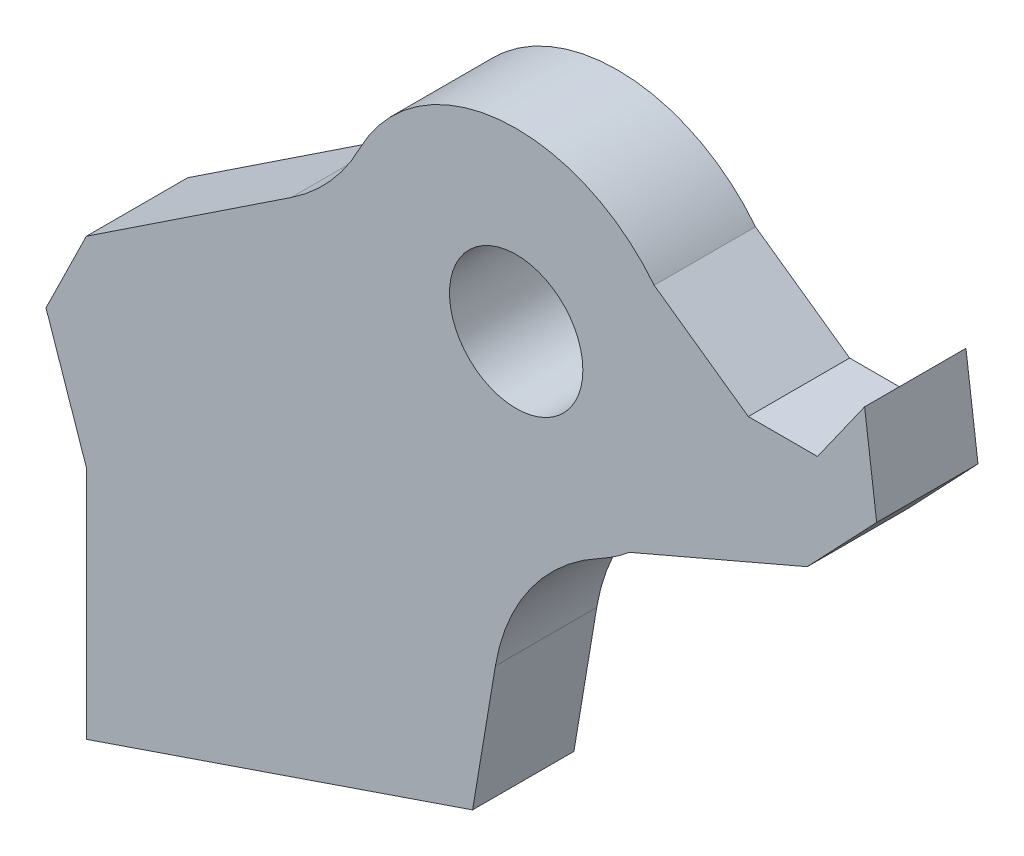
ISO-10303-21;
HEADER;
FILE_DESCRIPTION(('STEP AP214'),'2;1');
FILE_NAME('part.step','',(''),(''),'','','');
FILE_SCHEMA(('AUTOMOTIVE_DESIGN { 1 0 10303 214 1 1 1 1 }'));
ENDSEC;
DATA;
#1=APPLICATION_CONTEXT('core data for automotive mechanical design processes');
#2=APPLICATION_PROTOCOL_DEFINITION('international standard','automotive_design',2000,#1);
#3=PRODUCT_CONTEXT('',#1,'mechanical');
#4=PRODUCT('Part','Part','',(#3));
#5=PRODUCT_RELATED_PRODUCT_CATEGORY('part','',(#4));
#6=PRODUCT_DEFINITION_FORMATION('','',#4);
#7=PRODUCT_DEFINITION_CONTEXT('part definition',#1,'design');
#8=PRODUCT_DEFINITION('design','',#6,#7);
#9=PRODUCT_DEFINITION_SHAPE('','',#8);
#10=(LENGTH_UNIT() NAMED_UNIT(*) SI_UNIT(.MILLI.,.METRE.));
#11=(NAMED_UNIT(*) PLANE_ANGLE_UNIT() SI_UNIT($,.RADIAN.));
#12=(NAMED_UNIT(*) SI_UNIT($,.STERADIAN.) SOLID_ANGLE_UNIT());
#13=UNCERTAINTY_MEASURE_WITH_UNIT(LENGTH_MEASURE(1.E-05),#10,'distance_accuracy_value','');
#14=(GEOMETRIC_REPRESENTATION_CONTEXT(3) GLOBAL_UNCERTAINTY_ASSIGNED_CONTEXT((#13)) GLOBAL_UNIT_ASSIGNED_CONTEXT((#10,
#11,#12)) REPRESENTATION_CONTEXT('',''));
#15=CARTESIAN_POINT('',(0.,0.,0.));
#16=DIRECTION('',(0.,0.,1.));
#17=DIRECTION('',(1.,0.,0.));
#18=AXIS2_PLACEMENT_3D('',#15,#16,#17);
#19=CARTESIAN_POINT('',(593.775672351459,134.91328652826,-3.175));
#20=DIRECTION('',(-0.946288950125691,-0.32332216575734,0.));
#21=DIRECTION('',(0.32332216575734,-0.946288950125692,0.));
#22=AXIS2_PLACEMENT_3D('',#19,#20,#21);
#23=PLANE('',#22);
#24=DIRECTION('',(0.,0.,1.));
#25=VECTOR('',#24,1.);
#26=CARTESIAN_POINT('',(596.301932931905,127.519508044764,-3.175));
#27=LINE('',#26,#25);
#28=CARTESIAN_POINT('',(596.301932931905,127.519508044764,-3.175));
#29=VERTEX_POINT('',#28);
#30=CARTESIAN_POINT('',(596.301932931905,127.519508044764,3.175));
#31=VERTEX_POINT('',#30);
#32=EDGE_CURVE('E138',#29,#31,#27,.T.);
#33=ORIENTED_EDGE('',*,*,#32,.T.);
#34=DIRECTION('',(0.32332216575734,-0.946288950125691,0.));
#35=VECTOR('',#34,1.);
#36=CARTESIAN_POINT('',(593.775672351459,134.91328652826,3.175));
#37=LINE('',#36,#35);
#38=CARTESIAN_POINT('',(593.775672351459,134.91328652826,3.175));
#39=VERTEX_POINT('',#38);
#40=EDGE_CURVE('E247',#39,#31,#37,.T.);
#41=ORIENTED_EDGE('',*,*,#40,.F.);
#42=DIRECTION('',(0.,0.,1.));
#43=VECTOR('',#42,1.);
#44=CARTESIAN_POINT('',(593.775672351459,134.91328652826,-3.175));
#45=LINE('',#44,#43);
#46=CARTESIAN_POINT('',(593.775672351459,134.91328652826,-3.175));
#47=VERTEX_POINT('',#46);
#48=EDGE_CURVE('E12',#47,#39,#45,.T.);
#49=ORIENTED_EDGE('',*,*,#48,.F.);
#50=DIRECTION('',(0.32332216575734,-0.946288950125691,0.));
#51=VECTOR('',#50,1.);
#52=CARTESIAN_POINT('',(593.775672351459,134.91328652826,-3.175));
#53=LINE('',#52,#51);
#54=EDGE_CURVE('E248',#47,#29,#53,.T.);
#55=ORIENTED_EDGE('',*,*,#54,.T.);
#56=EDGE_LOOP('',(#33,#41,#49,#55));
#57=FACE_BOUND('',#56,.T.);
#58=ADVANCED_FACE('F135',(#57),#23,.T.);
#59=CARTESIAN_POINT('',(596.301932931905,140.061825094088,-3.175));
#60=DIRECTION('',(-0.897750629510671,0.440504037680921,0.));
#61=DIRECTION('',(-0.440504037680921,-0.897750629510671,0.));
#62=AXIS2_PLACEMENT_3D('',#59,#60,#61);
#63=PLANE('',#62);
#64=ORIENTED_EDGE('',*,*,#48,.T.);
#65=DIRECTION('',(-0.440504037680921,-0.897750629510671,0.));
#66=VECTOR('',#65,1.);
#67=CARTESIAN_POINT('',(596.301932931905,140.061825094088,3.175));
#68=LINE('',#67,#66);
#69=CARTESIAN_POINT('',(596.301932931905,140.061825094088,3.175));
#70=VERTEX_POINT('',#69);
#71=EDGE_CURVE('E266',#70,#39,#68,.T.);
#72=ORIENTED_EDGE('',*,*,#71,.F.);
#73=DIRECTION('',(0.,0.,1.));
#74=VECTOR('',#73,1.);
#75=CARTESIAN_POINT('',(596.301932931905,140.061825094088,-3.175));
#76=LINE('',#75,#74);
#77=CARTESIAN_POINT('',(596.301932931905,140.061825094088,-3.175));
#78=VERTEX_POINT('',#77);
#79=EDGE_CURVE('E143',#78,#70,#76,.T.);
#80=ORIENTED_EDGE('',*,*,#79,.F.);
#81=DIRECTION('',(-0.440504037680921,-0.897750629510671,0.));
#82=VECTOR('',#81,1.);
#83=CARTESIAN_POINT('',(596.301932931905,140.061825094088,-3.175));
#84=LINE('',#83,#82);
#85=EDGE_CURVE('E253',#78,#47,#84,.T.);
#86=ORIENTED_EDGE('',*,*,#85,.T.);
#87=EDGE_LOOP('',(#64,#72,#80,#86));
#88=FACE_BOUND('',#87,.T.);
#89=ADVANCED_FACE('F431',(#88),#63,.T.);
#90=CARTESIAN_POINT('',(596.301932931905,140.061825094088,-3.175));
#91=DIRECTION('',(0.553054088856797,-0.83314535034337,0.));
#92=DIRECTION('',(0.833145350343371,0.553054088856798,0.));
#93=AXIS2_PLACEMENT_3D('',#90,#91,#92);
#94=PLANE('',#93);
#95=ORIENTED_EDGE('',*,*,#79,.T.);
#96=DIRECTION('',(0.83314535034337,0.553054088856797,0.));
#97=VECTOR('',#96,1.);
#98=CARTESIAN_POINT('',(596.301932931905,140.061825094088,3.175));
#99=LINE('',#98,#97);
#100=CARTESIAN_POINT('',(609.146322901836,148.588119322117,3.175));
#101=VERTEX_POINT('',#100);
#102=EDGE_CURVE('E306',#70,#101,#99,.T.);
#103=ORIENTED_EDGE('',*,*,#102,.T.);
#104=DIRECTION('',(0.,0.,1.));
#105=VECTOR('',#104,1.);
#106=CARTESIAN_POINT('',(609.146322901836,148.588119322117,-3.175));
#107=LINE('',#106,#105);
#108=CARTESIAN_POINT('',(609.146322901836,148.588119322117,-3.175));
#109=VERTEX_POINT('',#108);
#110=EDGE_CURVE('E350',#109,#101,#107,.T.);
#111=ORIENTED_EDGE('',*,*,#110,.F.);
#112=DIRECTION('',(0.83314535034337,0.553054088856797,0.));
#113=VECTOR('',#112,1.);
#114=CARTESIAN_POINT('',(596.301932931905,140.061825094088,-3.175));
#115=LINE('',#114,#113);
#116=EDGE_CURVE('E346',#78,#109,#115,.T.);
#117=ORIENTED_EDGE('',*,*,#116,.F.);
#118=EDGE_LOOP('',(#95,#103,#111,#117));
#119=FACE_BOUND('',#118,.T.);
#120=ADVANCED_FACE('F429',(#119),#94,.F.);
#121=CARTESIAN_POINT('',(602.122535973355,159.169065271478,-3.175));
#122=DIRECTION('',(0.,0.,1.));
#123=DIRECTION('',(1.,0.,0.));
#124=AXIS2_PLACEMENT_3D('',#121,#122,#123);
#125=CYLINDRICAL_SURFACE('',#124,12.7);
#126=ORIENTED_EDGE('',*,*,#110,.T.);
#127=CARTESIAN_POINT('',(602.122535973355,159.169065271478,3.175));
#128=DIRECTION('',(0.,0.,-1.));
#129=DIRECTION('',(-1.,0.,0.));
#130=AXIS2_PLACEMENT_3D('',#127,#128,#129);
#131=CIRCLE('',#130,12.7);
#132=CARTESIAN_POINT('',(613.427511309233,153.382223934859,3.175));
#133=VERTEX_POINT('',#132);
#134=EDGE_CURVE('E303',#133,#101,#131,.T.);
#135=ORIENTED_EDGE('',*,*,#134,.F.);
#136=DIRECTION('',(0.,0.,1.));
#137=VECTOR('',#136,1.);
#138=CARTESIAN_POINT('',(613.427511309233,153.382223934859,-3.175));
#139=LINE('',#138,#137);
#140=CARTESIAN_POINT('',(613.427511309233,153.382223934859,-3.175));
#141=VERTEX_POINT('',#140);
#142=EDGE_CURVE('E352',#141,#133,#139,.T.);
#143=ORIENTED_EDGE('',*,*,#142,.F.);
#144=CARTESIAN_POINT('',(602.122535973355,159.169065271478,-3.175));
#145=DIRECTION('',(0.,0.,-1.));
#146=DIRECTION('',(-1.,0.,0.));
#147=AXIS2_PLACEMENT_3D('',#144,#145,#146);
#148=CIRCLE('',#147,12.7);
#149=EDGE_CURVE('E343',#141,#109,#148,.T.);
#150=ORIENTED_EDGE('',*,*,#149,.T.);
#151=EDGE_LOOP('',(#126,#135,#143,#150));
#152=FACE_BOUND('',#151,.T.);
#153=ADVANCED_FACE('F425',(#152),#125,.F.);
#154=CARTESIAN_POINT('',(623.238490422276,148.360136066708,-3.175));
#155=DIRECTION('',(0.,0.,1.));
#156=DIRECTION('',(1.,0.,0.));
#157=AXIS2_PLACEMENT_3D('',#154,#155,#156);
#158=CYLINDRICAL_SURFACE('',#157,11.0216458712839);
#159=ORIENTED_EDGE('',*,*,#142,.T.);
#160=CARTESIAN_POINT('',(623.238490422276,148.360136066708,3.175));
#161=DIRECTION('',(0.,0.,1.));
#162=DIRECTION('',(1.,0.,0.));
#163=AXIS2_PLACEMENT_3D('',#160,#161,#162);
#164=CIRCLE('',#163,11.0216458712839);
#165=CARTESIAN_POINT('',(631.886802034864,155.192660048632,3.175));
#166=VERTEX_POINT('',#165);
#167=EDGE_CURVE('E300',#166,#133,#164,.T.);
#168=ORIENTED_EDGE('',*,*,#167,.F.);
#169=DIRECTION('',(0.,0.,1.));
#170=VECTOR('',#169,1.);
#171=CARTESIAN_POINT('',(631.886802034864,155.192660048632,-3.175));
#172=LINE('',#171,#170);
#173=CARTESIAN_POINT('',(631.886802034864,155.192660048632,-3.175));
#174=VERTEX_POINT('',#173);
#175=EDGE_CURVE('E354',#174,#166,#172,.T.);
#176=ORIENTED_EDGE('',*,*,#175,.F.);
#177=CARTESIAN_POINT('',(623.238490422276,148.360136066708,-3.175));
#178=DIRECTION('',(0.,0.,1.));
#179=DIRECTION('',(1.,0.,0.));
#180=AXIS2_PLACEMENT_3D('',#177,#178,#179);
#181=CIRCLE('',#180,11.0216458712839);
#182=EDGE_CURVE('E340',#174,#141,#181,.T.);
#183=ORIENTED_EDGE('',*,*,#182,.T.);
#184=EDGE_LOOP('',(#159,#168,#176,#183));
#185=FACE_BOUND('',#184,.T.);
#186=ADVANCED_FACE('F432',(#185),#158,.T.);
#187=CARTESIAN_POINT('',(631.886802034864,155.192660048632,-3.175));
#188=DIRECTION('',(-0.577642801625076,-0.816289650633115,0.));
#189=DIRECTION('',(0.816289650633115,-0.577642801625076,0.));
#190=AXIS2_PLACEMENT_3D('',#187,#188,#189);
#191=PLANE('',#190);
#192=ORIENTED_EDGE('',*,*,#175,.T.);
#193=DIRECTION('',(0.816289650633115,-0.577642801625076,0.));
#194=VECTOR('',#193,1.);
#195=CARTESIAN_POINT('',(631.886802034864,155.192660048632,3.175));
#196=LINE('',#195,#194);
#197=CARTESIAN_POINT('',(637.784779862509,151.018989056183,3.175));
#198=VERTEX_POINT('',#197);
#199=EDGE_CURVE('E297',#166,#198,#196,.T.);
#200=ORIENTED_EDGE('',*,*,#199,.T.);
#201=DIRECTION('',(0.,0.,1.));
#202=VECTOR('',#201,1.);
#203=CARTESIAN_POINT('',(637.784779862509,151.018989056183,-3.175));
#204=LINE('',#203,#202);
#205=CARTESIAN_POINT('',(637.784779862509,151.018989056183,-3.175));
#206=VERTEX_POINT('',#205);
#207=EDGE_CURVE('E356',#206,#198,#204,.T.);
#208=ORIENTED_EDGE('',*,*,#207,.F.);
#209=DIRECTION('',(0.816289650633115,-0.577642801625076,0.));
#210=VECTOR('',#209,1.);
#211=CARTESIAN_POINT('',(631.886802034864,155.192660048632,-3.175));
#212=LINE('',#211,#210);
#213=EDGE_CURVE('E338',#174,#206,#212,.T.);
#214=ORIENTED_EDGE('',*,*,#213,.F.);
#215=EDGE_LOOP('',(#192,#200,#208,#214));
#216=FACE_BOUND('',#215,.T.);
#217=ADVANCED_FACE('F419',(#216),#191,.F.);
#218=CARTESIAN_POINT('',(637.784779862509,151.018989056183,-3.175));
#219=DIRECTION('',(0.,-1.,0.));
#220=DIRECTION('',(0.,0.,-1.));
#221=AXIS2_PLACEMENT_3D('',#218,#219,#220);
#222=PLANE('',#221);
#223=ORIENTED_EDGE('',*,*,#207,.T.);
#224=DIRECTION('',(1.,0.,0.));
#225=VECTOR('',#224,1.);
#226=CARTESIAN_POINT('',(637.784779862509,151.018989056183,3.175));
#227=LINE('',#226,#225);
#228=CARTESIAN_POINT('',(642.120102737764,151.018989056183,3.175));
#229=VERTEX_POINT('',#228);
#230=EDGE_CURVE('E294',#198,#229,#227,.T.);
#231=ORIENTED_EDGE('',*,*,#230,.T.);
#232=DIRECTION('',(0.,0.,1.));
#233=VECTOR('',#232,1.);
#234=CARTESIAN_POINT('',(642.120102737764,151.018989056183,-3.175));
#235=LINE('',#234,#233);
#236=CARTESIAN_POINT('',(642.120102737764,151.018989056183,-3.175));
#237=VERTEX_POINT('',#236);
#238=EDGE_CURVE('E358',#237,#229,#235,.T.);
#239=ORIENTED_EDGE('',*,*,#238,.F.);
#240=DIRECTION('',(1.,0.,0.));
#241=VECTOR('',#240,1.);
#242=CARTESIAN_POINT('',(637.784779862509,151.018989056183,-3.175));
#243=LINE('',#242,#241);
#244=EDGE_CURVE('E336',#206,#237,#243,.T.);
#245=ORIENTED_EDGE('',*,*,#244,.F.);
#246=EDGE_LOOP('',(#223,#231,#239,#245));
#247=FACE_BOUND('',#246,.T.);
#248=ADVANCED_FACE('F414',(#247),#222,.F.);
#249=CARTESIAN_POINT('',(642.120102737764,151.018989056183,-3.175));
#250=DIRECTION('',(0.816289650633116,-0.577642801625075,0.));
#251=DIRECTION('',(0.577642801625075,0.816289650633116,0.));
#252=AXIS2_PLACEMENT_3D('',#249,#250,#251);
#253=PLANE('',#252);
#254=ORIENTED_EDGE('',*,*,#238,.T.);
#255=DIRECTION('',(0.577642801625075,0.816289650633116,0.));
#256=VECTOR('',#255,1.);
#257=CARTESIAN_POINT('',(642.120102737764,151.018989056183,3.175));
#258=LINE('',#257,#256);
#259=CARTESIAN_POINT('',(645.073577651073,155.192660048632,3.175));
#260=VERTEX_POINT('',#259);
#261=EDGE_CURVE('E291',#229,#260,#258,.T.);
#262=ORIENTED_EDGE('',*,*,#261,.T.);
#263=DIRECTION('',(0.,0.,1.));
#264=VECTOR('',#263,1.);
#265=CARTESIAN_POINT('',(645.073577651073,155.192660048632,-3.175));
#266=LINE('',#265,#264);
#267=CARTESIAN_POINT('',(645.073577651073,155.192660048632,-3.175));
#268=VERTEX_POINT('',#267);
#269=EDGE_CURVE('E360',#268,#260,#266,.T.);
#270=ORIENTED_EDGE('',*,*,#269,.F.);
#271=DIRECTION('',(0.577642801625075,0.816289650633116,0.));
#272=VECTOR('',#271,1.);
#273=CARTESIAN_POINT('',(642.120102737764,151.018989056183,-3.175));
#274=LINE('',#273,#272);
#275=EDGE_CURVE('E334',#237,#268,#274,.T.);
#276=ORIENTED_EDGE('',*,*,#275,.F.);
#277=EDGE_LOOP('',(#254,#262,#270,#276));
#278=FACE_BOUND('',#277,.T.);
#279=ADVANCED_FACE('F409',(#278),#253,.F.);
#280=CARTESIAN_POINT('',(645.073577651073,155.192660048632,-3.175));
#281=DIRECTION('',(-0.991920057111568,-0.126864495820475,0.));
#282=DIRECTION('',(0.126864495820475,-0.991920057111568,0.));
#283=AXIS2_PLACEMENT_3D('',#280,#281,#282);
#284=PLANE('',#283);
#285=ORIENTED_EDGE('',*,*,#269,.T.);
#286=DIRECTION('',(0.126864495820475,-0.991920057111568,0.));
#287=VECTOR('',#286,1.);
#288=CARTESIAN_POINT('',(645.073577651073,155.192660048632,3.175));
#289=LINE('',#288,#287);
#290=CARTESIAN_POINT('',(645.828084101164,149.293372968945,3.175));
#291=VERTEX_POINT('',#290);
#292=EDGE_CURVE('E288',#260,#291,#289,.T.);
#293=ORIENTED_EDGE('',*,*,#292,.T.);
#294=DIRECTION('',(0.,0.,1.));
#295=VECTOR('',#294,1.);
#296=CARTESIAN_POINT('',(645.828084101164,149.293372968945,-3.175));
#297=LINE('',#296,#295);
#298=CARTESIAN_POINT('',(645.828084101164,149.293372968945,-3.175));
#299=VERTEX_POINT('',#298);
#300=EDGE_CURVE('E362',#299,#291,#297,.T.);
#301=ORIENTED_EDGE('',*,*,#300,.F.);
#302=DIRECTION('',(0.126864495820475,-0.991920057111568,0.));
#303=VECTOR('',#302,1.);
#304=CARTESIAN_POINT('',(645.073577651073,155.192660048632,-3.175));
#305=LINE('',#304,#303);
#306=EDGE_CURVE('E332',#268,#299,#305,.T.);
#307=ORIENTED_EDGE('',*,*,#306,.F.);
#308=EDGE_LOOP('',(#285,#293,#301,#307));
#309=FACE_BOUND('',#308,.T.);
#310=ADVANCED_FACE('F404',(#309),#284,.F.);
#311=CARTESIAN_POINT('',(645.828084101164,149.293372968945,-3.175));
#312=DIRECTION('',(-0.724807268382959,0.68895168458988,0.));
#313=DIRECTION('',(-0.68895168458988,-0.724807268382959,0.));
#314=AXIS2_PLACEMENT_3D('',#311,#312,#313);
#315=PLANE('',#314);
#316=ORIENTED_EDGE('',*,*,#300,.T.);
#317=DIRECTION('',(-0.68895168458988,-0.724807268382959,0.));
#318=VECTOR('',#317,1.);
#319=CARTESIAN_POINT('',(645.828084101164,149.293372968945,3.175));
#320=LINE('',#319,#318);
#321=CARTESIAN_POINT('',(641.475190914575,144.713939184683,3.175));
#322=VERTEX_POINT('',#321);
#323=EDGE_CURVE('E285',#291,#322,#320,.T.);
#324=ORIENTED_EDGE('',*,*,#323,.T.);
#325=DIRECTION('',(0.,0.,1.));
#326=VECTOR('',#325,1.);
#327=CARTESIAN_POINT('',(641.475190914575,144.713939184683,-3.175));
#328=LINE('',#327,#326);
#329=CARTESIAN_POINT('',(641.475190914575,144.713939184683,-3.175));
#330=VERTEX_POINT('',#329);
#331=EDGE_CURVE('E364',#330,#322,#328,.T.);
#332=ORIENTED_EDGE('',*,*,#331,.F.);
#333=DIRECTION('',(-0.68895168458988,-0.724807268382959,0.));
#334=VECTOR('',#333,1.);
#335=CARTESIAN_POINT('',(645.828084101164,149.293372968945,-3.175));
#336=LINE('',#335,#334);
#337=EDGE_CURVE('E330',#299,#330,#336,.T.);
#338=ORIENTED_EDGE('',*,*,#337,.F.);
#339=EDGE_LOOP('',(#316,#324,#332,#338));
#340=FACE_BOUND('',#339,.T.);
#341=ADVANCED_FACE('F399',(#340),#315,.F.);
#342=CARTESIAN_POINT('',(641.475190914575,144.713939184683,-3.175));
#343=DIRECTION('',(-0.3950010361384,0.918680674363835,0.));
#344=DIRECTION('',(-0.918680674363835,-0.3950010361384,0.));
#345=AXIS2_PLACEMENT_3D('',#342,#343,#344);
#346=PLANE('',#345);
#347=ORIENTED_EDGE('',*,*,#331,.T.);
#348=DIRECTION('',(-0.918680674363835,-0.3950010361384,0.));
#349=VECTOR('',#348,1.);
#350=CARTESIAN_POINT('',(641.475190914575,144.713939184683,3.175));
#351=LINE('',#350,#349);
#352=CARTESIAN_POINT('',(630.327572389346,139.92084731847,3.175));
#353=VERTEX_POINT('',#352);
#354=EDGE_CURVE('E282',#322,#353,#351,.T.);
#355=ORIENTED_EDGE('',*,*,#354,.T.);
#356=DIRECTION('',(0.,0.,1.));
#357=VECTOR('',#356,1.);
#358=CARTESIAN_POINT('',(630.327572389346,139.92084731847,-3.175));
#359=LINE('',#358,#357);
#360=CARTESIAN_POINT('',(630.327572389346,139.92084731847,-3.175));
#361=VERTEX_POINT('',#360);
#362=EDGE_CURVE('E366',#361,#353,#359,.T.);
#363=ORIENTED_EDGE('',*,*,#362,.F.);
#364=DIRECTION('',(-0.918680674363835,-0.3950010361384,0.));
#365=VECTOR('',#364,1.);
#366=CARTESIAN_POINT('',(641.475190914575,144.713939184683,-3.175));
#367=LINE('',#366,#365);
#368=EDGE_CURVE('E328',#330,#361,#367,.T.);
#369=ORIENTED_EDGE('',*,*,#368,.F.);
#370=EDGE_LOOP('',(#347,#355,#363,#369));
#371=FACE_BOUND('',#370,.T.);
#372=ADVANCED_FACE('F395',(#371),#346,.F.);
#373=CARTESIAN_POINT('',(623.238490422276,148.360136066708,-3.175));
#374=DIRECTION('',(0.,0.,1.));
#375=DIRECTION('',(1.,0.,0.));
#376=AXIS2_PLACEMENT_3D('',#373,#374,#375);
#377=CYLINDRICAL_SURFACE('',#376,11.0216458712839);
#378=ORIENTED_EDGE('',*,*,#362,.T.);
#379=CARTESIAN_POINT('',(623.238490422276,148.360136066708,3.175));
#380=DIRECTION('',(0.,0.,1.));
#381=DIRECTION('',(1.,0.,0.));
#382=AXIS2_PLACEMENT_3D('',#379,#380,#381);
#383=CIRCLE('',#382,11.0216458712839);
#384=CARTESIAN_POINT('',(628.45270562465,138.649902416825,3.175));
#385=VERTEX_POINT('',#384);
#386=EDGE_CURVE('E279',#385,#353,#383,.T.);
#387=ORIENTED_EDGE('',*,*,#386,.F.);
#388=DIRECTION('',(0.,0.,1.));
#389=VECTOR('',#388,1.);
#390=CARTESIAN_POINT('',(628.45270562465,138.649902416825,-3.175));
#391=LINE('',#390,#389);
#392=CARTESIAN_POINT('',(628.45270562465,138.649902416825,-3.175));
#393=VERTEX_POINT('',#392);
#394=EDGE_CURVE('E368',#393,#385,#391,.T.);
#395=ORIENTED_EDGE('',*,*,#394,.F.);
#396=CARTESIAN_POINT('',(623.238490422276,148.360136066708,-3.175));
#397=DIRECTION('',(0.,0.,1.));
#398=DIRECTION('',(1.,0.,0.));
#399=AXIS2_PLACEMENT_3D('',#396,#397,#398);
#400=CIRCLE('',#399,11.0216458712839);
#401=EDGE_CURVE('E325',#393,#361,#400,.T.);
#402=ORIENTED_EDGE('',*,*,#401,.T.);
#403=EDGE_LOOP('',(#378,#387,#395,#402));
#404=FACE_BOUND('',#403,.T.);
#405=ADVANCED_FACE('F390',(#404),#377,.T.);
#406=CARTESIAN_POINT('',(634.460931060625,127.461013861187,-3.175));
#407=DIRECTION('',(0.,0.,1.));
#408=DIRECTION('',(1.,0.,0.));
#409=AXIS2_PLACEMENT_3D('',#406,#407,#408);
#410=CYLINDRICAL_SURFACE('',#409,12.7);
#411=ORIENTED_EDGE('',*,*,#394,.T.);
#412=CARTESIAN_POINT('',(634.460931060625,127.461013861187,3.175));
#413=DIRECTION('',(0.,0.,-1.));
#414=DIRECTION('',(-1.,0.,0.));
#415=AXIS2_PLACEMENT_3D('',#412,#413,#414);
#416=CIRCLE('',#415,12.7);
#417=CARTESIAN_POINT('',(621.935426786886,129.55904691349,3.175));
#418=VERTEX_POINT('',#417);
#419=EDGE_CURVE('E276',#418,#385,#416,.T.);
#420=ORIENTED_EDGE('',*,*,#419,.F.);
#421=DIRECTION('',(0.,0.,1.));
#422=VECTOR('',#421,1.);
#423=CARTESIAN_POINT('',(621.935426786886,129.55904691349,-3.175));
#424=LINE('',#423,#422);
#425=CARTESIAN_POINT('',(621.935426786886,129.55904691349,-3.175));
#426=VERTEX_POINT('',#425);
#427=EDGE_CURVE('E370',#426,#418,#424,.T.);
#428=ORIENTED_EDGE('',*,*,#427,.F.);
#429=CARTESIAN_POINT('',(634.460931060625,127.461013861187,-3.175));
#430=DIRECTION('',(0.,0.,-1.));
#431=DIRECTION('',(-1.,0.,0.));
#432=AXIS2_PLACEMENT_3D('',#429,#430,#431);
#433=CIRCLE('',#432,12.7);
#434=EDGE_CURVE('E322',#426,#393,#433,.T.);
#435=ORIENTED_EDGE('',*,*,#434,.T.);
#436=EDGE_LOOP('',(#411,#420,#428,#435));
#437=FACE_BOUND('',#436,.T.);
#438=ADVANCED_FACE('F383',(#437),#410,.F.);
#439=CARTESIAN_POINT('',(620.507043958666,121.031433299513,-3.175));
#440=DIRECTION('',(0.986260179034525,-0.165199452937313,0.));
#441=DIRECTION('',(0.165199452937313,0.986260179034525,0.));
#442=AXIS2_PLACEMENT_3D('',#439,#440,#441);
#443=PLANE('',#442);
#444=ORIENTED_EDGE('',*,*,#427,.T.);
#445=DIRECTION('',(0.165199452937313,0.986260179034525,0.));
#446=VECTOR('',#445,1.);
#447=CARTESIAN_POINT('',(620.507043958666,121.031433299513,3.175));
#448=LINE('',#447,#446);
#449=CARTESIAN_POINT('',(620.507043958666,121.031433299513,3.175));
#450=VERTEX_POINT('',#449);
#451=EDGE_CURVE('E273',#450,#418,#448,.T.);
#452=ORIENTED_EDGE('',*,*,#451,.F.);
#453=DIRECTION('',(0.,0.,1.));
#454=VECTOR('',#453,1.);
#455=CARTESIAN_POINT('',(620.507043958666,121.031433299513,-3.175));
#456=LINE('',#455,#454);
#457=CARTESIAN_POINT('',(620.507043958666,121.031433299513,-3.175));
#458=VERTEX_POINT('',#457);
#459=EDGE_CURVE('E372',#458,#450,#456,.T.);
#460=ORIENTED_EDGE('',*,*,#459,.F.);
#461=DIRECTION('',(0.165199452937313,0.986260179034525,0.));
#462=VECTOR('',#461,1.);
#463=CARTESIAN_POINT('',(620.507043958666,121.031433299513,-3.175));
#464=LINE('',#463,#462);
#465=EDGE_CURVE('E319',#458,#426,#464,.T.);
#466=ORIENTED_EDGE('',*,*,#465,.T.);
#467=EDGE_LOOP('',(#444,#452,#460,#466));
#468=FACE_BOUND('',#467,.T.);
#469=ADVANCED_FACE('F380',(#468),#443,.T.);
#470=CARTESIAN_POINT('',(596.301932931904,112.761180414779,-3.175));
#471=DIRECTION('',(0.323322165757307,-0.946288950125702,0.));
#472=DIRECTION('',(0.946288950125702,0.323322165757307,0.));
#473=AXIS2_PLACEMENT_3D('',#470,#471,#472);
#474=PLANE('',#473);
#475=ORIENTED_EDGE('',*,*,#459,.T.);
#476=DIRECTION('',(0.946288950125702,0.323322165757307,0.));
#477=VECTOR('',#476,1.);
#478=CARTESIAN_POINT('',(596.301932931904,112.761180414779,3.175));
#479=LINE('',#478,#477);
#480=CARTESIAN_POINT('',(596.301932931904,112.761180414779,3.175));
#481=VERTEX_POINT('',#480);
#482=EDGE_CURVE('E260',#481,#450,#479,.T.);
#483=ORIENTED_EDGE('',*,*,#482,.F.);
#484=DIRECTION('',(0.,0.,1.));
#485=VECTOR('',#484,1.);
#486=CARTESIAN_POINT('',(596.301932931904,112.761180414779,-3.175));
#487=LINE('',#486,#485);
#488=CARTESIAN_POINT('',(596.301932931904,112.761180414779,-3.175));
#489=VERTEX_POINT('',#488);
#490=EDGE_CURVE('E252',#489,#481,#487,.T.);
#491=ORIENTED_EDGE('',*,*,#490,.F.);
#492=DIRECTION('',(0.946288950125702,0.323322165757307,0.));
#493=VECTOR('',#492,1.);
#494=CARTESIAN_POINT('',(596.301932931904,112.761180414779,-3.175));
#495=LINE('',#494,#493);
#496=EDGE_CURVE('E316',#489,#458,#495,.T.);
#497=ORIENTED_EDGE('',*,*,#496,.T.);
#498=EDGE_LOOP('',(#475,#483,#491,#497));
#499=FACE_BOUND('',#498,.T.);
#500=ADVANCED_FACE('F374',(#499),#474,.T.);
#501=CARTESIAN_POINT('',(596.301932931905,127.519508044764,-3.175));
#502=DIRECTION('',(-1.,0.,0.));
#503=DIRECTION('',(0.,-1.,0.));
#504=AXIS2_PLACEMENT_3D('',#501,#502,#503);
#505=PLANE('',#504);
#506=ORIENTED_EDGE('',*,*,#490,.T.);
#507=DIRECTION('',(0.,-1.,0.));
#508=VECTOR('',#507,1.);
#509=CARTESIAN_POINT('',(596.301932931905,127.519508044764,3.175));
#510=LINE('',#509,#508);
#511=EDGE_CURVE('E255',#31,#481,#510,.T.);
#512=ORIENTED_EDGE('',*,*,#511,.F.);
#513=ORIENTED_EDGE('',*,*,#32,.F.);
#514=DIRECTION('',(0.,-1.,0.));
#515=VECTOR('',#514,1.);
#516=CARTESIAN_POINT('',(596.301932931905,127.519508044764,-3.175));
#517=LINE('',#516,#515);
#518=EDGE_CURVE('E314',#29,#489,#517,.T.);
#519=ORIENTED_EDGE('',*,*,#518,.T.);
#520=EDGE_LOOP('',(#506,#512,#513,#519));
#521=FACE_BOUND('',#520,.T.);
#522=ADVANCED_FACE('F256',(#521),#505,.T.);
#523=CARTESIAN_POINT('',(634.460931060625,127.461013861187,-3.175));
#524=DIRECTION('',(0.,0.,-1.));
#525=DIRECTION('',(-1.,0.,0.));
#526=AXIS2_PLACEMENT_3D('',#523,#524,#525);
#527=PLANE('',#526);
#528=CARTESIAN_POINT('',(623.238490422276,148.360136066708,-3.175));
#529=DIRECTION('',(0.,0.,1.));
#530=DIRECTION('',(1.,0.,0.));
#531=AXIS2_PLACEMENT_3D('',#528,#529,#530);
#532=CIRCLE('',#531,4.17867083278624);
#533=CARTESIAN_POINT('',(627.417161255062,148.360136066708,-3.175));
#534=VERTEX_POINT('',#533);
#535=EDGE_CURVE('E310',#534,#534,#532,.T.);
#536=ORIENTED_EDGE('',*,*,#535,.T.);
#537=EDGE_LOOP('',(#536));
#538=FACE_BOUND('',#537,.T.);
#539=ORIENTED_EDGE('',*,*,#54,.F.);
#540=ORIENTED_EDGE('',*,*,#85,.F.);
#541=ORIENTED_EDGE('',*,*,#116,.T.);
#542=ORIENTED_EDGE('',*,*,#149,.F.);
#543=ORIENTED_EDGE('',*,*,#182,.F.);
#544=ORIENTED_EDGE('',*,*,#213,.T.);
#545=ORIENTED_EDGE('',*,*,#244,.T.);
#546=ORIENTED_EDGE('',*,*,#275,.T.);
#547=ORIENTED_EDGE('',*,*,#306,.T.);
#548=ORIENTED_EDGE('',*,*,#337,.T.);
#549=ORIENTED_EDGE('',*,*,#368,.T.);
#550=ORIENTED_EDGE('',*,*,#401,.F.);
#551=ORIENTED_EDGE('',*,*,#434,.F.);
#552=ORIENTED_EDGE('',*,*,#465,.F.);
#553=ORIENTED_EDGE('',*,*,#496,.F.);
#554=ORIENTED_EDGE('',*,*,#518,.F.);
#555=EDGE_LOOP('',(#539,#540,#541,#542,#543,#544,#545,#546,#547,#548,#549,#550,#551,#552,#553,#554));
#556=FACE_BOUND('',#555,.T.);
#557=ADVANCED_FACE('F386',(#538,#556),#527,.T.);
#558=CARTESIAN_POINT('',(623.238490422276,148.360136066708,-3.175));
#559=DIRECTION('',(0.,0.,1.));
#560=DIRECTION('',(1.,0.,0.));
#561=AXIS2_PLACEMENT_3D('',#558,#559,#560);
#562=CYLINDRICAL_SURFACE('',#561,4.17867083278624);
#563=ORIENTED_EDGE('',*,*,#535,.F.);
#564=EDGE_LOOP('',(#563));
#565=FACE_BOUND('',#564,.T.);
#566=CARTESIAN_POINT('',(623.238490422276,148.360136066708,3.175));
#567=DIRECTION('',(0.,0.,1.));
#568=DIRECTION('',(1.,0.,0.));
#569=AXIS2_PLACEMENT_3D('',#566,#567,#568);
#570=CIRCLE('',#569,4.17867083278624);
#571=CARTESIAN_POINT('',(627.417161255062,148.360136066708,3.175));
#572=VERTEX_POINT('',#571);
#573=EDGE_CURVE('E267',#572,#572,#570,.T.);
#574=ORIENTED_EDGE('',*,*,#573,.T.);
#575=EDGE_LOOP('',(#574));
#576=FACE_BOUND('',#575,.T.);
#577=ADVANCED_FACE('F453',(#565,#576),#562,.F.);
#578=CARTESIAN_POINT('',(634.460931060625,127.461013861187,3.175));
#579=DIRECTION('',(0.,0.,-1.));
#580=DIRECTION('',(-1.,0.,0.));
#581=AXIS2_PLACEMENT_3D('',#578,#579,#580);
#582=PLANE('',#581);
#583=ORIENTED_EDGE('',*,*,#40,.T.);
#584=ORIENTED_EDGE('',*,*,#511,.T.);
#585=ORIENTED_EDGE('',*,*,#482,.T.);
#586=ORIENTED_EDGE('',*,*,#451,.T.);
#587=ORIENTED_EDGE('',*,*,#419,.T.);
#588=ORIENTED_EDGE('',*,*,#386,.T.);
#589=ORIENTED_EDGE('',*,*,#354,.F.);
#590=ORIENTED_EDGE('',*,*,#323,.F.);
#591=ORIENTED_EDGE('',*,*,#292,.F.);
#592=ORIENTED_EDGE('',*,*,#261,.F.);
#593=ORIENTED_EDGE('',*,*,#230,.F.);
#594=ORIENTED_EDGE('',*,*,#199,.F.);
#595=ORIENTED_EDGE('',*,*,#167,.T.);
#596=ORIENTED_EDGE('',*,*,#134,.T.);
#597=ORIENTED_EDGE('',*,*,#102,.F.);
#598=ORIENTED_EDGE('',*,*,#71,.T.);
#599=EDGE_LOOP('',(#583,#584,#585,#586,#587,#588,#589,#590,#591,#592,#593,#594,#595,#596,#597,#598));
#600=FACE_BOUND('',#599,.T.);
#601=ORIENTED_EDGE('',*,*,#573,.F.);
#602=EDGE_LOOP('',(#601));
#603=FACE_BOUND('',#602,.T.);
#604=ADVANCED_FACE('F263',(#600,#603),#582,.F.);
#605=CLOSED_SHELL('',(#58,#89,#120,#153,#186,#217,#248,#279,#310,#341,#372,#405,#438,#469,#500,
#522,#557,#577,#604));
#606=MANIFOLD_SOLID_BREP('B2',#605);
#607=ADVANCED_BREP_SHAPE_REPRESENTATION('',(#18,#606),#14);
#608=SHAPE_DEFINITION_REPRESENTATION(#9,#607);
ENDSEC;
END-ISO-10303-21;
